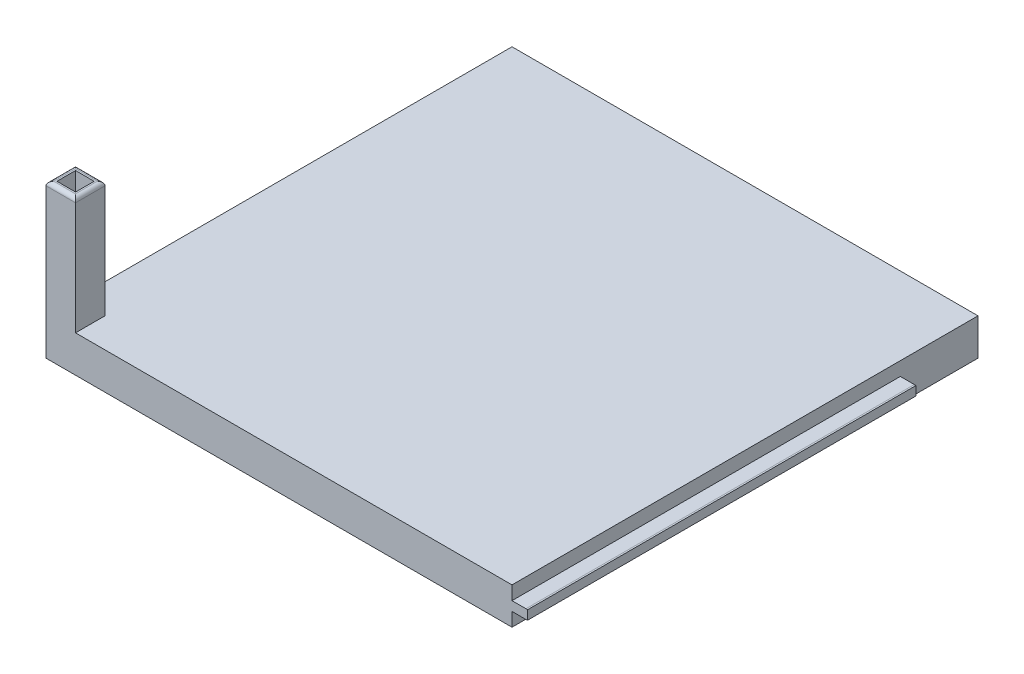
ISO-10303-21;
HEADER;
FILE_DESCRIPTION(('STEP AP214'),'2;1');
FILE_NAME('part.step','',(''),(''),'','','');
FILE_SCHEMA(('AUTOMOTIVE_DESIGN { 1 0 10303 214 1 1 1 1 }'));
ENDSEC;
DATA;
#1=APPLICATION_CONTEXT('core data for automotive mechanical design processes');
#2=APPLICATION_PROTOCOL_DEFINITION('international standard','automotive_design',2000,#1);
#3=PRODUCT_CONTEXT('',#1,'mechanical');
#4=PRODUCT('Part','Part','',(#3));
#5=PRODUCT_RELATED_PRODUCT_CATEGORY('part','',(#4));
#6=PRODUCT_DEFINITION_FORMATION('','',#4);
#7=PRODUCT_DEFINITION_CONTEXT('part definition',#1,'design');
#8=PRODUCT_DEFINITION('design','',#6,#7);
#9=PRODUCT_DEFINITION_SHAPE('','',#8);
#10=(LENGTH_UNIT() NAMED_UNIT(*) SI_UNIT(.MILLI.,.METRE.));
#11=(NAMED_UNIT(*) PLANE_ANGLE_UNIT() SI_UNIT($,.RADIAN.));
#12=(NAMED_UNIT(*) SI_UNIT($,.STERADIAN.) SOLID_ANGLE_UNIT());
#13=UNCERTAINTY_MEASURE_WITH_UNIT(LENGTH_MEASURE(1.E-05),#10,'distance_accuracy_value','');
#14=(GEOMETRIC_REPRESENTATION_CONTEXT(3) GLOBAL_UNCERTAINTY_ASSIGNED_CONTEXT((#13)) GLOBAL_UNIT_ASSIGNED_CONTEXT((#10,
#11,#12)) REPRESENTATION_CONTEXT('',''));
#15=CARTESIAN_POINT('',(0.,0.,0.));
#16=DIRECTION('',(0.,0.,1.));
#17=DIRECTION('',(1.,0.,0.));
#18=AXIS2_PLACEMENT_3D('',#15,#16,#17);
#19=CARTESIAN_POINT('',(-13.9392121212121,48.83,0.));
#20=DIRECTION('',(0.,0.,-1.));
#21=DIRECTION('',(-1.,0.,0.));
#22=AXIS2_PLACEMENT_3D('',#19,#20,#21);
#23=CYLINDRICAL_SURFACE('',#22,1.27);
#24=CARTESIAN_POINT('',(-13.9392121212121,48.83,128.143));
#25=DIRECTION('',(-0.707106781186547,0.,-0.707106781186548));
#26=DIRECTION('',(-0.707106781186548,0.,0.707106781186547));
#27=AXIS2_PLACEMENT_3D('',#24,#25,#26);
#28=ELLIPSE('',#27,1.79605122421383,1.27);
#29=CARTESIAN_POINT('',(-13.9392121212121,50.1,128.143));
#30=VERTEX_POINT('',#29);
#31=CARTESIAN_POINT('',(-12.6692121212121,48.83,126.873));
#32=VERTEX_POINT('',#31);
#33=EDGE_CURVE('E11',#30,#32,#28,.T.);
#34=ORIENTED_EDGE('',*,*,#33,.F.);
#35=DIRECTION('',(0.,0.,-1.));
#36=VECTOR('',#35,1.);
#37=CARTESIAN_POINT('',(-13.9392121212121,50.1,0.));
#38=LINE('',#37,#36);
#39=CARTESIAN_POINT('',(-13.9392121212121,50.1,135.255));
#40=VERTEX_POINT('',#39);
#41=EDGE_CURVE('E560',#40,#30,#38,.T.);
#42=ORIENTED_EDGE('',*,*,#41,.F.);
#43=CARTESIAN_POINT('',(-13.9392121212121,48.83,135.255));
#44=DIRECTION('',(0.707106781186548,0.,-0.707106781186547));
#45=DIRECTION('',(-0.707106781186547,0.,-0.707106781186548));
#46=AXIS2_PLACEMENT_3D('',#43,#44,#45);
#47=ELLIPSE('',#46,1.79605122421383,1.27);
#48=CARTESIAN_POINT('',(-12.6692121212121,48.83,136.525));
#49=VERTEX_POINT('',#48);
#50=EDGE_CURVE('E55',#40,#49,#47,.T.);
#51=ORIENTED_EDGE('',*,*,#50,.T.);
#52=DIRECTION('',(0.,0.,-1.));
#53=VECTOR('',#52,1.);
#54=CARTESIAN_POINT('',(-12.6692121212121,48.83,136.525));
#55=LINE('',#54,#53);
#56=EDGE_CURVE('E587',#32,#49,#55,.F.);
#57=ORIENTED_EDGE('',*,*,#56,.F.);
#58=EDGE_LOOP('',(#34,#42,#51,#57));
#59=FACE_BOUND('',#58,.T.);
#60=ADVANCED_FACE('F47',(#59),#23,.T.);
#61=CARTESIAN_POINT('',(0.,48.83,135.255));
#62=DIRECTION('',(1.,0.,0.));
#63=DIRECTION('',(0.,0.,-1.));
#64=AXIS2_PLACEMENT_3D('',#61,#62,#63);
#65=CYLINDRICAL_SURFACE('',#64,1.27);
#66=ORIENTED_EDGE('',*,*,#50,.F.);
#67=DIRECTION('',(1.,0.,0.));
#68=VECTOR('',#67,1.);
#69=CARTESIAN_POINT('',(0.,50.1,135.255));
#70=LINE('',#69,#68);
#71=CARTESIAN_POINT('',(-21.0512121212121,50.1,135.255));
#72=VERTEX_POINT('',#71);
#73=EDGE_CURVE('E564',#72,#40,#70,.T.);
#74=ORIENTED_EDGE('',*,*,#73,.F.);
#75=CARTESIAN_POINT('',(-21.0512121212121,48.83,135.255));
#76=DIRECTION('',(0.707106781186547,0.,0.707106781186547));
#77=DIRECTION('',(0.707106781186547,0.,-0.707106781186547));
#78=AXIS2_PLACEMENT_3D('',#75,#76,#77);
#79=ELLIPSE('',#78,1.79605122421383,1.27);
#80=CARTESIAN_POINT('',(-22.3212121212121,48.83,136.525));
#81=VERTEX_POINT('',#80);
#82=EDGE_CURVE('E69',#72,#81,#79,.T.);
#83=ORIENTED_EDGE('',*,*,#82,.T.);
#84=DIRECTION('',(1.,0.,0.));
#85=VECTOR('',#84,1.);
#86=CARTESIAN_POINT('',(-22.3212121212121,48.83,136.525));
#87=LINE('',#86,#85);
#88=EDGE_CURVE('E584',#49,#81,#87,.F.);
#89=ORIENTED_EDGE('',*,*,#88,.F.);
#90=EDGE_LOOP('',(#66,#74,#83,#89));
#91=FACE_BOUND('',#90,.T.);
#92=ADVANCED_FACE('F670',(#91),#65,.T.);
#93=CARTESIAN_POINT('',(-21.0512121212121,48.83,0.));
#94=DIRECTION('',(0.,0.,1.));
#95=DIRECTION('',(1.,0.,0.));
#96=AXIS2_PLACEMENT_3D('',#93,#94,#95);
#97=CYLINDRICAL_SURFACE('',#96,1.27);
#98=ORIENTED_EDGE('',*,*,#82,.F.);
#99=DIRECTION('',(0.,0.,1.));
#100=VECTOR('',#99,1.);
#101=CARTESIAN_POINT('',(-21.0512121212121,50.1,0.));
#102=LINE('',#101,#100);
#103=CARTESIAN_POINT('',(-21.0512121212121,50.1,128.143));
#104=VERTEX_POINT('',#103);
#105=EDGE_CURVE('E568',#104,#72,#102,.T.);
#106=ORIENTED_EDGE('',*,*,#105,.F.);
#107=CARTESIAN_POINT('',(-21.0512121212121,48.83,128.143));
#108=DIRECTION('',(-0.707106781186547,0.,0.707106781186547));
#109=DIRECTION('',(0.707106781186547,0.,0.707106781186547));
#110=AXIS2_PLACEMENT_3D('',#107,#108,#109);
#111=ELLIPSE('',#110,1.79605122421383,1.27);
#112=CARTESIAN_POINT('',(-22.3212121212121,48.83,126.873));
#113=VERTEX_POINT('',#112);
#114=EDGE_CURVE('E590',#104,#113,#111,.T.);
#115=ORIENTED_EDGE('',*,*,#114,.T.);
#116=DIRECTION('',(0.,0.,1.));
#117=VECTOR('',#116,1.);
#118=CARTESIAN_POINT('',(-22.3212121212121,48.83,-15.875));
#119=LINE('',#118,#117);
#120=EDGE_CURVE('E580',#81,#113,#119,.F.);
#121=ORIENTED_EDGE('',*,*,#120,.F.);
#122=EDGE_LOOP('',(#98,#106,#115,#121));
#123=FACE_BOUND('',#122,.T.);
#124=ADVANCED_FACE('F675',(#123),#97,.T.);
#125=CARTESIAN_POINT('',(0.,48.83,128.143));
#126=DIRECTION('',(-1.,0.,0.));
#127=DIRECTION('',(0.,0.,1.));
#128=AXIS2_PLACEMENT_3D('',#125,#126,#127);
#129=CYLINDRICAL_SURFACE('',#128,1.27);
#130=DIRECTION('',(-1.,0.,0.));
#131=VECTOR('',#130,1.);
#132=CARTESIAN_POINT('',(0.,50.1,128.143));
#133=LINE('',#132,#131);
#134=EDGE_CURVE('E572',#30,#104,#133,.T.);
#135=ORIENTED_EDGE('',*,*,#134,.F.);
#136=ORIENTED_EDGE('',*,*,#33,.T.);
#137=DIRECTION('',(-1.,0.,0.));
#138=VECTOR('',#137,1.);
#139=CARTESIAN_POINT('',(-22.3212121212121,48.83,126.873));
#140=LINE('',#139,#138);
#141=EDGE_CURVE('E576',#113,#32,#140,.F.);
#142=ORIENTED_EDGE('',*,*,#141,.F.);
#143=ORIENTED_EDGE('',*,*,#114,.F.);
#144=EDGE_LOOP('',(#135,#136,#142,#143));
#145=FACE_BOUND('',#144,.T.);
#146=ADVANCED_FACE('F625',(#145),#129,.T.);
#147=CARTESIAN_POINT('',(0.,50.1,0.));
#148=DIRECTION('',(0.,-1.,0.));
#149=DIRECTION('',(0.,0.,-1.));
#150=AXIS2_PLACEMENT_3D('',#147,#148,#149);
#151=PLANE('',#150);
#152=ORIENTED_EDGE('',*,*,#41,.T.);
#153=ORIENTED_EDGE('',*,*,#134,.T.);
#154=ORIENTED_EDGE('',*,*,#105,.T.);
#155=ORIENTED_EDGE('',*,*,#73,.T.);
#156=EDGE_LOOP('',(#152,#153,#154,#155));
#157=FACE_BOUND('',#156,.T.);
#158=DIRECTION('',(0.,0.,1.));
#159=VECTOR('',#158,1.);
#160=CARTESIAN_POINT('',(-20.5432121212121,50.1,0.));
#161=LINE('',#160,#159);
#162=CARTESIAN_POINT('',(-20.5432121212121,50.1,128.651));
#163=VERTEX_POINT('',#162);
#164=CARTESIAN_POINT('',(-20.5432121212121,50.1,134.747));
#165=VERTEX_POINT('',#164);
#166=EDGE_CURVE('E346',#163,#165,#161,.T.);
#167=ORIENTED_EDGE('',*,*,#166,.F.);
#168=DIRECTION('',(-1.,0.,0.));
#169=VECTOR('',#168,1.);
#170=CARTESIAN_POINT('',(0.,50.1,128.651));
#171=LINE('',#170,#169);
#172=CARTESIAN_POINT('',(-14.4472121212121,50.1,128.651));
#173=VERTEX_POINT('',#172);
#174=EDGE_CURVE('E322',#173,#163,#171,.T.);
#175=ORIENTED_EDGE('',*,*,#174,.F.);
#176=DIRECTION('',(0.,0.,-1.));
#177=VECTOR('',#176,1.);
#178=CARTESIAN_POINT('',(-14.4472121212121,50.1,0.));
#179=LINE('',#178,#177);
#180=CARTESIAN_POINT('',(-14.4472121212121,50.1,134.747));
#181=VERTEX_POINT('',#180);
#182=EDGE_CURVE('E363',#181,#173,#179,.T.);
#183=ORIENTED_EDGE('',*,*,#182,.F.);
#184=DIRECTION('',(1.,0.,0.));
#185=VECTOR('',#184,1.);
#186=CARTESIAN_POINT('',(0.,50.1,134.747));
#187=LINE('',#186,#185);
#188=EDGE_CURVE('E360',#165,#181,#187,.T.);
#189=ORIENTED_EDGE('',*,*,#188,.F.);
#190=EDGE_LOOP('',(#167,#175,#183,#189));
#191=FACE_BOUND('',#190,.T.);
#192=ADVANCED_FACE('F678',(#157,#191),#151,.F.);
#193=CARTESIAN_POINT('',(130.078787878788,12.,-15.875));
#194=DIRECTION('',(-1.,0.,0.));
#195=DIRECTION('',(0.,0.,1.));
#196=AXIS2_PLACEMENT_3D('',#193,#194,#195);
#197=PLANE('',#196);
#198=DIRECTION('',(0.,0.,1.));
#199=VECTOR('',#198,1.);
#200=CARTESIAN_POINT('',(130.078787878788,7.524,9.52500000000001));
#201=LINE('',#200,#199);
#202=CARTESIAN_POINT('',(130.078787878788,7.524,9.52500000000001));
#203=VERTEX_POINT('',#202);
#204=CARTESIAN_POINT('',(130.078787878788,7.524,136.525));
#205=VERTEX_POINT('',#204);
#206=EDGE_CURVE('E464',#203,#205,#201,.T.);
#207=ORIENTED_EDGE('',*,*,#206,.F.);
#208=DIRECTION('',(0.,-1.,0.));
#209=VECTOR('',#208,1.);
#210=CARTESIAN_POINT('',(130.078787878788,7.524,9.52500000000001));
#211=LINE('',#210,#209);
#212=CARTESIAN_POINT('',(130.078787878788,4.476,9.52500000000001));
#213=VERTEX_POINT('',#212);
#214=EDGE_CURVE('E440',#203,#213,#211,.T.);
#215=ORIENTED_EDGE('',*,*,#214,.T.);
#216=DIRECTION('',(0.,0.,1.));
#217=VECTOR('',#216,1.);
#218=CARTESIAN_POINT('',(130.078787878788,4.476,9.52500000000001));
#219=LINE('',#218,#217);
#220=CARTESIAN_POINT('',(130.078787878788,4.476,136.525));
#221=VERTEX_POINT('',#220);
#222=EDGE_CURVE('E455',#213,#221,#219,.T.);
#223=ORIENTED_EDGE('',*,*,#222,.T.);
#224=DIRECTION('',(0.,-1.,0.));
#225=VECTOR('',#224,1.);
#226=CARTESIAN_POINT('',(130.078787878788,12.,136.525));
#227=LINE('',#226,#225);
#228=CARTESIAN_POINT('',(130.078787878788,0.,136.525));
#229=VERTEX_POINT('',#228);
#230=EDGE_CURVE('E525',#221,#229,#227,.T.);
#231=ORIENTED_EDGE('',*,*,#230,.T.);
#232=DIRECTION('',(0.,0.,-1.));
#233=VECTOR('',#232,1.);
#234=CARTESIAN_POINT('',(130.078787878788,0.,-15.875));
#235=LINE('',#234,#233);
#236=CARTESIAN_POINT('',(130.078787878788,0.,-15.875));
#237=VERTEX_POINT('',#236);
#238=EDGE_CURVE('E511',#229,#237,#235,.T.);
#239=ORIENTED_EDGE('',*,*,#238,.T.);
#240=DIRECTION('',(0.,-1.,0.));
#241=VECTOR('',#240,1.);
#242=CARTESIAN_POINT('',(130.078787878788,12.,-15.875));
#243=LINE('',#242,#241);
#244=CARTESIAN_POINT('',(130.078787878788,12.,-15.875));
#245=VERTEX_POINT('',#244);
#246=EDGE_CURVE('E521',#245,#237,#243,.T.);
#247=ORIENTED_EDGE('',*,*,#246,.F.);
#248=DIRECTION('',(0.,0.,-1.));
#249=VECTOR('',#248,1.);
#250=CARTESIAN_POINT('',(130.078787878788,12.,-15.875));
#251=LINE('',#250,#249);
#252=CARTESIAN_POINT('',(130.078787878788,12.,136.525));
#253=VERTEX_POINT('',#252);
#254=EDGE_CURVE('E497',#253,#245,#251,.T.);
#255=ORIENTED_EDGE('',*,*,#254,.F.);
#256=EDGE_CURVE('E526',#253,#205,#227,.T.);
#257=ORIENTED_EDGE('',*,*,#256,.T.);
#258=EDGE_LOOP('',(#207,#215,#223,#231,#239,#247,#255,#257));
#259=FACE_BOUND('',#258,.T.);
#260=ADVANCED_FACE('F641',(#259),#197,.F.);
#261=CARTESIAN_POINT('',(-22.3212121212121,12.,-15.875));
#262=DIRECTION('',(1.,0.,0.));
#263=DIRECTION('',(0.,0.,-1.));
#264=AXIS2_PLACEMENT_3D('',#261,#262,#263);
#265=PLANE('',#264);
#266=DIRECTION('',(0.,-1.,0.));
#267=VECTOR('',#266,1.);
#268=CARTESIAN_POINT('',(-22.3212121212121,12.,136.525));
#269=LINE('',#268,#267);
#270=CARTESIAN_POINT('',(-22.3212121212121,0.,136.525));
#271=VERTEX_POINT('',#270);
#272=EDGE_CURVE('E530',#81,#271,#269,.T.);
#273=ORIENTED_EDGE('',*,*,#272,.F.);
#274=ORIENTED_EDGE('',*,*,#120,.T.);
#275=DIRECTION('',(0.,-1.,0.));
#276=VECTOR('',#275,1.);
#277=CARTESIAN_POINT('',(-22.3212121212121,50.1,126.873));
#278=LINE('',#277,#276);
#279=CARTESIAN_POINT('',(-22.3212121212121,12.,126.873));
#280=VERTEX_POINT('',#279);
#281=EDGE_CURVE('E479',#113,#280,#278,.T.);
#282=ORIENTED_EDGE('',*,*,#281,.T.);
#283=DIRECTION('',(0.,0.,1.));
#284=VECTOR('',#283,1.);
#285=CARTESIAN_POINT('',(-22.3212121212121,12.,-15.875));
#286=LINE('',#285,#284);
#287=CARTESIAN_POINT('',(-22.3212121212121,12.,-15.875));
#288=VERTEX_POINT('',#287);
#289=EDGE_CURVE('E489',#288,#280,#286,.T.);
#290=ORIENTED_EDGE('',*,*,#289,.F.);
#291=DIRECTION('',(0.,-1.,0.));
#292=VECTOR('',#291,1.);
#293=CARTESIAN_POINT('',(-22.3212121212121,12.,-15.875));
#294=LINE('',#293,#292);
#295=CARTESIAN_POINT('',(-22.3212121212121,7.5875,-15.875));
#296=VERTEX_POINT('',#295);
#297=EDGE_CURVE('E517',#288,#296,#294,.T.);
#298=ORIENTED_EDGE('',*,*,#297,.T.);
#299=DIRECTION('',(0.,0.,1.));
#300=VECTOR('',#299,1.);
#301=CARTESIAN_POINT('',(-22.3212121212121,7.5875,-15.875));
#302=LINE('',#301,#300);
#303=CARTESIAN_POINT('',(-22.3212121212121,7.5875,-10.541));
#304=VERTEX_POINT('',#303);
#305=EDGE_CURVE('E406',#296,#304,#302,.T.);
#306=ORIENTED_EDGE('',*,*,#305,.T.);
#307=DIRECTION('',(0.,-1.,0.));
#308=VECTOR('',#307,1.);
#309=CARTESIAN_POINT('',(-22.3212121212121,7.5875,-10.541));
#310=LINE('',#309,#308);
#311=CARTESIAN_POINT('',(-22.3212121212121,4.4125,-10.541));
#312=VERTEX_POINT('',#311);
#313=EDGE_CURVE('E420',#304,#312,#310,.T.);
#314=ORIENTED_EDGE('',*,*,#313,.T.);
#315=DIRECTION('',(0.,0.,1.));
#316=VECTOR('',#315,1.);
#317=CARTESIAN_POINT('',(-22.3212121212121,4.4125,-15.875));
#318=LINE('',#317,#316);
#319=CARTESIAN_POINT('',(-22.3212121212121,4.4125,-15.875));
#320=VERTEX_POINT('',#319);
#321=EDGE_CURVE('E397',#320,#312,#318,.T.);
#322=ORIENTED_EDGE('',*,*,#321,.F.);
#323=CARTESIAN_POINT('',(-22.3212121212121,0.,-15.875));
#324=VERTEX_POINT('',#323);
#325=EDGE_CURVE('E503',#320,#324,#294,.T.);
#326=ORIENTED_EDGE('',*,*,#325,.T.);
#327=DIRECTION('',(0.,0.,1.));
#328=VECTOR('',#327,1.);
#329=CARTESIAN_POINT('',(-22.3212121212121,0.,-15.875));
#330=LINE('',#329,#328);
#331=EDGE_CURVE('E488',#324,#271,#330,.T.);
#332=ORIENTED_EDGE('',*,*,#331,.T.);
#333=EDGE_LOOP('',(#273,#274,#282,#290,#298,#306,#314,#322,#326,#332));
#334=FACE_BOUND('',#333,.T.);
#335=ADVANCED_FACE('F602',(#334),#265,.F.);
#336=CARTESIAN_POINT('',(-22.3212121212121,12.,136.525));
#337=DIRECTION('',(0.,0.,-1.));
#338=DIRECTION('',(-1.,0.,0.));
#339=AXIS2_PLACEMENT_3D('',#336,#337,#338);
#340=PLANE('',#339);
#341=DIRECTION('',(0.,-1.,0.));
#342=VECTOR('',#341,1.);
#343=CARTESIAN_POINT('',(-12.6692121212121,50.1,136.525));
#344=LINE('',#343,#342);
#345=CARTESIAN_POINT('',(-12.6692121212121,12.,136.525));
#346=VERTEX_POINT('',#345);
#347=EDGE_CURVE('E485',#49,#346,#344,.T.);
#348=ORIENTED_EDGE('',*,*,#347,.F.);
#349=ORIENTED_EDGE('',*,*,#88,.T.);
#350=ORIENTED_EDGE('',*,*,#272,.T.);
#351=DIRECTION('',(1.,0.,0.));
#352=VECTOR('',#351,1.);
#353=CARTESIAN_POINT('',(-22.3212121212121,0.,136.525));
#354=LINE('',#353,#352);
#355=EDGE_CURVE('E507',#271,#229,#354,.T.);
#356=ORIENTED_EDGE('',*,*,#355,.T.);
#357=ORIENTED_EDGE('',*,*,#230,.F.);
#358=DIRECTION('',(1.,0.,0.));
#359=VECTOR('',#358,1.);
#360=CARTESIAN_POINT('',(130.078787878788,4.476,136.525));
#361=LINE('',#360,#359);
#362=CARTESIAN_POINT('',(134.650787878788,4.476,136.525));
#363=VERTEX_POINT('',#362);
#364=EDGE_CURVE('E430',#221,#363,#361,.T.);
#365=ORIENTED_EDGE('',*,*,#364,.T.);
#366=DIRECTION('',(-0.997564050259824,-0.0697564737441264,0.));
#367=VECTOR('',#366,1.);
#368=CARTESIAN_POINT('',(134.650787878788,4.476,136.525));
#369=LINE('',#368,#367);
#370=CARTESIAN_POINT('',(135.158787878788,4.51152282046731,136.525));
#371=VERTEX_POINT('',#370);
#372=EDGE_CURVE('E551',#363,#371,#369,.F.);
#373=ORIENTED_EDGE('',*,*,#372,.T.);
#374=DIRECTION('',(0.,1.,0.));
#375=VECTOR('',#374,1.);
#376=CARTESIAN_POINT('',(135.158787878788,7.524,136.525));
#377=LINE('',#376,#375);
#378=CARTESIAN_POINT('',(135.158787878788,7.48847717953269,136.525));
#379=VERTEX_POINT('',#378);
#380=EDGE_CURVE('E459',#371,#379,#377,.T.);
#381=ORIENTED_EDGE('',*,*,#380,.T.);
#382=DIRECTION('',(0.997564050259824,-0.0697564737441272,0.));
#383=VECTOR('',#382,1.);
#384=CARTESIAN_POINT('',(135.158787878788,7.48847717953269,136.525));
#385=LINE('',#384,#383);
#386=CARTESIAN_POINT('',(134.650787878788,7.524,136.525));
#387=VERTEX_POINT('',#386);
#388=EDGE_CURVE('E537',#379,#387,#385,.F.);
#389=ORIENTED_EDGE('',*,*,#388,.T.);
#390=DIRECTION('',(-1.,0.,0.));
#391=VECTOR('',#390,1.);
#392=CARTESIAN_POINT('',(130.078787878788,7.524,136.525));
#393=LINE('',#392,#391);
#394=EDGE_CURVE('E445',#387,#205,#393,.T.);
#395=ORIENTED_EDGE('',*,*,#394,.T.);
#396=ORIENTED_EDGE('',*,*,#256,.F.);
#397=DIRECTION('',(1.,0.,0.));
#398=VECTOR('',#397,1.);
#399=CARTESIAN_POINT('',(-22.3212121212121,12.,136.525));
#400=LINE('',#399,#398);
#401=EDGE_CURVE('E493',#346,#253,#400,.T.);
#402=ORIENTED_EDGE('',*,*,#401,.F.);
#403=EDGE_LOOP('',(#348,#349,#350,#356,#357,#365,#373,#381,#389,#395,#396,#402));
#404=FACE_BOUND('',#403,.T.);
#405=ADVANCED_FACE('F617',(#404),#340,.F.);
#406=CARTESIAN_POINT('',(-22.3212121212121,12.,-15.875));
#407=DIRECTION('',(0.,0.,1.));
#408=DIRECTION('',(1.,0.,0.));
#409=AXIS2_PLACEMENT_3D('',#406,#407,#408);
#410=PLANE('',#409);
#411=ORIENTED_EDGE('',*,*,#325,.F.);
#412=DIRECTION('',(-1.,0.,0.));
#413=VECTOR('',#412,1.);
#414=CARTESIAN_POINT('',(127.538787878788,4.4125,-15.875));
#415=LINE('',#414,#413);
#416=CARTESIAN_POINT('',(127.538787878788,4.4125,-15.875));
#417=VERTEX_POINT('',#416);
#418=EDGE_CURVE('E427',#417,#320,#415,.T.);
#419=ORIENTED_EDGE('',*,*,#418,.F.);
#420=DIRECTION('',(0.,-1.,0.));
#421=VECTOR('',#420,1.);
#422=CARTESIAN_POINT('',(127.538787878788,7.5875,-15.875));
#423=LINE('',#422,#421);
#424=CARTESIAN_POINT('',(127.538787878788,7.5875,-15.875));
#425=VERTEX_POINT('',#424);
#426=EDGE_CURVE('E412',#425,#417,#423,.T.);
#427=ORIENTED_EDGE('',*,*,#426,.F.);
#428=DIRECTION('',(-1.,0.,0.));
#429=VECTOR('',#428,1.);
#430=CARTESIAN_POINT('',(127.538787878788,7.5875,-15.875));
#431=LINE('',#430,#429);
#432=EDGE_CURVE('E431',#425,#296,#431,.T.);
#433=ORIENTED_EDGE('',*,*,#432,.T.);
#434=ORIENTED_EDGE('',*,*,#297,.F.);
#435=DIRECTION('',(-1.,0.,0.));
#436=VECTOR('',#435,1.);
#437=CARTESIAN_POINT('',(-22.3212121212121,12.,-15.875));
#438=LINE('',#437,#436);
#439=EDGE_CURVE('E500',#245,#288,#438,.T.);
#440=ORIENTED_EDGE('',*,*,#439,.F.);
#441=ORIENTED_EDGE('',*,*,#246,.T.);
#442=DIRECTION('',(-1.,0.,0.));
#443=VECTOR('',#442,1.);
#444=CARTESIAN_POINT('',(-22.3212121212121,0.,-15.875));
#445=LINE('',#444,#443);
#446=EDGE_CURVE('E494',#237,#324,#445,.T.);
#447=ORIENTED_EDGE('',*,*,#446,.T.);
#448=EDGE_LOOP('',(#411,#419,#427,#433,#434,#440,#441,#447));
#449=FACE_BOUND('',#448,.T.);
#450=ADVANCED_FACE('F607',(#449),#410,.F.);
#451=CARTESIAN_POINT('',(0.,12.,0.));
#452=DIRECTION('',(0.,1.,0.));
#453=DIRECTION('',(0.,0.,1.));
#454=AXIS2_PLACEMENT_3D('',#451,#452,#453);
#455=PLANE('',#454);
#456=DIRECTION('',(-1.,0.,0.));
#457=VECTOR('',#456,1.);
#458=CARTESIAN_POINT('',(-22.3212121212121,12.,126.873));
#459=LINE('',#458,#457);
#460=CARTESIAN_POINT('',(-12.6692121212121,12.,126.873));
#461=VERTEX_POINT('',#460);
#462=EDGE_CURVE('E475',#461,#280,#459,.T.);
#463=ORIENTED_EDGE('',*,*,#462,.F.);
#464=DIRECTION('',(0.,0.,-1.));
#465=VECTOR('',#464,1.);
#466=CARTESIAN_POINT('',(-12.6692121212121,12.,136.525));
#467=LINE('',#466,#465);
#468=EDGE_CURVE('E468',#346,#461,#467,.T.);
#469=ORIENTED_EDGE('',*,*,#468,.F.);
#470=ORIENTED_EDGE('',*,*,#401,.T.);
#471=ORIENTED_EDGE('',*,*,#254,.T.);
#472=ORIENTED_EDGE('',*,*,#439,.T.);
#473=ORIENTED_EDGE('',*,*,#289,.T.);
#474=EDGE_LOOP('',(#463,#469,#470,#471,#472,#473));
#475=FACE_BOUND('',#474,.T.);
#476=ADVANCED_FACE('F632',(#475),#455,.T.);
#477=CARTESIAN_POINT('',(0.,0.,0.));
#478=DIRECTION('',(0.,1.,0.));
#479=DIRECTION('',(0.,0.,1.));
#480=AXIS2_PLACEMENT_3D('',#477,#478,#479);
#481=PLANE('',#480);
#482=CARTESIAN_POINT('',(100.106787878788,0.,9.12499999999999));
#483=DIRECTION('',(0.,1.,0.));
#484=DIRECTION('',(0.,0.,1.));
#485=AXIS2_PLACEMENT_3D('',#482,#483,#484);
#486=CIRCLE('',#485,4.445);
#487=CARTESIAN_POINT('',(100.106787878788,0.,13.57));
#488=VERTEX_POINT('',#487);
#489=EDGE_CURVE('E392',#488,#488,#486,.T.);
#490=ORIENTED_EDGE('',*,*,#489,.T.);
#491=EDGE_LOOP('',(#490));
#492=FACE_BOUND('',#491,.T.);
#493=ORIENTED_EDGE('',*,*,#331,.F.);
#494=ORIENTED_EDGE('',*,*,#446,.F.);
#495=ORIENTED_EDGE('',*,*,#238,.F.);
#496=ORIENTED_EDGE('',*,*,#355,.F.);
#497=EDGE_LOOP('',(#493,#494,#495,#496));
#498=FACE_BOUND('',#497,.T.);
#499=ADVANCED_FACE('F613',(#492,#498),#481,.F.);
#500=CARTESIAN_POINT('',(-12.6692121212121,50.1,136.525));
#501=DIRECTION('',(-1.,0.,0.));
#502=DIRECTION('',(0.,0.,1.));
#503=AXIS2_PLACEMENT_3D('',#500,#501,#502);
#504=PLANE('',#503);
#505=DIRECTION('',(0.,-1.,0.));
#506=VECTOR('',#505,1.);
#507=CARTESIAN_POINT('',(-12.6692121212121,50.1,126.873));
#508=LINE('',#507,#506);
#509=EDGE_CURVE('E482',#32,#461,#508,.T.);
#510=ORIENTED_EDGE('',*,*,#509,.F.);
#511=ORIENTED_EDGE('',*,*,#56,.T.);
#512=ORIENTED_EDGE('',*,*,#347,.T.);
#513=ORIENTED_EDGE('',*,*,#468,.T.);
#514=EDGE_LOOP('',(#510,#511,#512,#513));
#515=FACE_BOUND('',#514,.T.);
#516=ADVANCED_FACE('F635',(#515),#504,.F.);
#517=CARTESIAN_POINT('',(-22.3212121212121,50.1,126.873));
#518=DIRECTION('',(0.,0.,1.));
#519=DIRECTION('',(1.,0.,0.));
#520=AXIS2_PLACEMENT_3D('',#517,#518,#519);
#521=PLANE('',#520);
#522=ORIENTED_EDGE('',*,*,#281,.F.);
#523=ORIENTED_EDGE('',*,*,#141,.T.);
#524=ORIENTED_EDGE('',*,*,#509,.T.);
#525=ORIENTED_EDGE('',*,*,#462,.T.);
#526=EDGE_LOOP('',(#522,#523,#524,#525));
#527=FACE_BOUND('',#526,.T.);
#528=ADVANCED_FACE('F628',(#527),#521,.F.);
#529=CARTESIAN_POINT('',(130.078787878788,7.524,9.52500000000001));
#530=DIRECTION('',(0.,1.,0.));
#531=DIRECTION('',(0.,0.,1.));
#532=AXIS2_PLACEMENT_3D('',#529,#530,#531);
#533=PLANE('',#532);
#534=ORIENTED_EDGE('',*,*,#394,.F.);
#535=DIRECTION('',(0.,0.,-1.));
#536=VECTOR('',#535,1.);
#537=CARTESIAN_POINT('',(134.650787878788,7.524,9.52500000000001));
#538=LINE('',#537,#536);
#539=CARTESIAN_POINT('',(134.650787878788,7.524,9.52500000000001));
#540=VERTEX_POINT('',#539);
#541=EDGE_CURVE('E540',#387,#540,#538,.T.);
#542=ORIENTED_EDGE('',*,*,#541,.T.);
#543=DIRECTION('',(-1.,0.,0.));
#544=VECTOR('',#543,1.);
#545=CARTESIAN_POINT('',(130.078787878788,7.524,9.52500000000001));
#546=LINE('',#545,#544);
#547=EDGE_CURVE('E452',#540,#203,#546,.T.);
#548=ORIENTED_EDGE('',*,*,#547,.T.);
#549=ORIENTED_EDGE('',*,*,#206,.T.);
#550=EDGE_LOOP('',(#534,#542,#548,#549));
#551=FACE_BOUND('',#550,.T.);
#552=ADVANCED_FACE('F718',(#551),#533,.T.);
#553=CARTESIAN_POINT('',(135.158787878788,7.524,9.52500000000001));
#554=DIRECTION('',(1.,0.,0.));
#555=DIRECTION('',(0.,0.,-1.));
#556=AXIS2_PLACEMENT_3D('',#553,#554,#555);
#557=PLANE('',#556);
#558=ORIENTED_EDGE('',*,*,#380,.F.);
#559=DIRECTION('',(0.,0.,-1.));
#560=VECTOR('',#559,1.);
#561=CARTESIAN_POINT('',(135.158787878788,4.51152282046731,9.52500000000001));
#562=LINE('',#561,#560);
#563=CARTESIAN_POINT('',(135.158787878788,4.51152282046731,9.52500000000001));
#564=VERTEX_POINT('',#563);
#565=EDGE_CURVE('E554',#371,#564,#562,.T.);
#566=ORIENTED_EDGE('',*,*,#565,.T.);
#567=DIRECTION('',(0.,1.,0.));
#568=VECTOR('',#567,1.);
#569=CARTESIAN_POINT('',(135.158787878788,7.524,9.52500000000001));
#570=LINE('',#569,#568);
#571=CARTESIAN_POINT('',(135.158787878788,7.48847717953269,9.52500000000001));
#572=VERTEX_POINT('',#571);
#573=EDGE_CURVE('E449',#564,#572,#570,.T.);
#574=ORIENTED_EDGE('',*,*,#573,.T.);
#575=DIRECTION('',(0.,0.,1.));
#576=VECTOR('',#575,1.);
#577=CARTESIAN_POINT('',(135.158787878788,7.48847717953269,9.52500000000001));
#578=LINE('',#577,#576);
#579=EDGE_CURVE('E533',#572,#379,#578,.T.);
#580=ORIENTED_EDGE('',*,*,#579,.T.);
#581=EDGE_LOOP('',(#558,#566,#574,#580));
#582=FACE_BOUND('',#581,.T.);
#583=ADVANCED_FACE('F724',(#582),#557,.T.);
#584=CARTESIAN_POINT('',(130.078787878788,4.476,9.52500000000001));
#585=DIRECTION('',(0.,-1.,0.));
#586=DIRECTION('',(0.,0.,-1.));
#587=AXIS2_PLACEMENT_3D('',#584,#585,#586);
#588=PLANE('',#587);
#589=DIRECTION('',(1.,0.,0.));
#590=VECTOR('',#589,1.);
#591=CARTESIAN_POINT('',(130.078787878788,4.476,9.52500000000001));
#592=LINE('',#591,#590);
#593=CARTESIAN_POINT('',(134.650787878788,4.476,9.52500000000001));
#594=VERTEX_POINT('',#593);
#595=EDGE_CURVE('E444',#213,#594,#592,.T.);
#596=ORIENTED_EDGE('',*,*,#595,.T.);
#597=DIRECTION('',(0.,0.,1.));
#598=VECTOR('',#597,1.);
#599=CARTESIAN_POINT('',(134.650787878788,4.476,9.52500000000001));
#600=LINE('',#599,#598);
#601=EDGE_CURVE('E547',#594,#363,#600,.T.);
#602=ORIENTED_EDGE('',*,*,#601,.T.);
#603=ORIENTED_EDGE('',*,*,#364,.F.);
#604=ORIENTED_EDGE('',*,*,#222,.F.);
#605=EDGE_LOOP('',(#596,#602,#603,#604));
#606=FACE_BOUND('',#605,.T.);
#607=ADVANCED_FACE('F721',(#606),#588,.T.);
#608=CARTESIAN_POINT('',(0.,0.,9.52500000000001));
#609=DIRECTION('',(0.,0.,1.));
#610=DIRECTION('',(1.,0.,0.));
#611=AXIS2_PLACEMENT_3D('',#608,#609,#610);
#612=PLANE('',#611);
#613=ORIENTED_EDGE('',*,*,#573,.F.);
#614=DIRECTION('',(0.997564050259824,0.0697564737441264,0.));
#615=VECTOR('',#614,1.);
#616=CARTESIAN_POINT('',(134.650787878788,4.476,9.52500000000001));
#617=LINE('',#616,#615);
#618=EDGE_CURVE('E557',#564,#594,#617,.F.);
#619=ORIENTED_EDGE('',*,*,#618,.T.);
#620=ORIENTED_EDGE('',*,*,#595,.F.);
#621=ORIENTED_EDGE('',*,*,#214,.F.);
#622=ORIENTED_EDGE('',*,*,#547,.F.);
#623=DIRECTION('',(-0.997564050259824,0.0697564737441272,0.));
#624=VECTOR('',#623,1.);
#625=CARTESIAN_POINT('',(135.158787878788,7.48847717953269,9.52500000000001));
#626=LINE('',#625,#624);
#627=EDGE_CURVE('E543',#540,#572,#626,.F.);
#628=ORIENTED_EDGE('',*,*,#627,.T.);
#629=EDGE_LOOP('',(#613,#619,#620,#621,#622,#628));
#630=FACE_BOUND('',#629,.T.);
#631=ADVANCED_FACE('F700',(#630),#612,.F.);
#632=CARTESIAN_POINT('',(135.158787878788,7.48847717953269,9.52500000000001));
#633=DIRECTION('',(-0.0697564737441272,-0.997564050259824,0.));
#634=DIRECTION('',(0.,0.,1.));
#635=AXIS2_PLACEMENT_3D('',#632,#633,#634);
#636=PLANE('',#635);
#637=ORIENTED_EDGE('',*,*,#627,.F.);
#638=ORIENTED_EDGE('',*,*,#541,.F.);
#639=ORIENTED_EDGE('',*,*,#388,.F.);
#640=ORIENTED_EDGE('',*,*,#579,.F.);
#641=EDGE_LOOP('',(#637,#638,#639,#640));
#642=FACE_BOUND('',#641,.T.);
#643=ADVANCED_FACE('F694',(#642),#636,.F.);
#644=CARTESIAN_POINT('',(134.650787878788,4.476,9.52500000000001));
#645=DIRECTION('',(-0.0697564737441264,0.997564050259824,0.));
#646=DIRECTION('',(0.,0.,1.));
#647=AXIS2_PLACEMENT_3D('',#644,#645,#646);
#648=PLANE('',#647);
#649=ORIENTED_EDGE('',*,*,#618,.F.);
#650=ORIENTED_EDGE('',*,*,#565,.F.);
#651=ORIENTED_EDGE('',*,*,#372,.F.);
#652=ORIENTED_EDGE('',*,*,#601,.F.);
#653=EDGE_LOOP('',(#649,#650,#651,#652));
#654=FACE_BOUND('',#653,.T.);
#655=ADVANCED_FACE('F688',(#654),#648,.F.);
#656=CARTESIAN_POINT('',(127.538787878788,4.4125,-15.875));
#657=DIRECTION('',(0.,-1.,0.));
#658=DIRECTION('',(0.,0.,-1.));
#659=AXIS2_PLACEMENT_3D('',#656,#657,#658);
#660=PLANE('',#659);
#661=ORIENTED_EDGE('',*,*,#321,.T.);
#662=DIRECTION('',(-1.,0.,0.));
#663=VECTOR('',#662,1.);
#664=CARTESIAN_POINT('',(127.538787878788,4.4125,-10.541));
#665=LINE('',#664,#663);
#666=CARTESIAN_POINT('',(127.538787878788,4.4125,-10.541));
#667=VERTEX_POINT('',#666);
#668=EDGE_CURVE('E416',#667,#312,#665,.T.);
#669=ORIENTED_EDGE('',*,*,#668,.F.);
#670=DIRECTION('',(0.,0.,1.));
#671=VECTOR('',#670,1.);
#672=CARTESIAN_POINT('',(127.538787878788,4.4125,-15.875));
#673=LINE('',#672,#671);
#674=EDGE_CURVE('E401',#417,#667,#673,.T.);
#675=ORIENTED_EDGE('',*,*,#674,.F.);
#676=ORIENTED_EDGE('',*,*,#418,.T.);
#677=EDGE_LOOP('',(#661,#669,#675,#676));
#678=FACE_BOUND('',#677,.T.);
#679=ADVANCED_FACE('F653',(#678),#660,.F.);
#680=CARTESIAN_POINT('',(127.538787878788,7.5875,-15.875));
#681=DIRECTION('',(0.,-1.,0.));
#682=DIRECTION('',(0.,0.,-1.));
#683=AXIS2_PLACEMENT_3D('',#680,#681,#682);
#684=PLANE('',#683);
#685=ORIENTED_EDGE('',*,*,#305,.F.);
#686=ORIENTED_EDGE('',*,*,#432,.F.);
#687=DIRECTION('',(0.,0.,1.));
#688=VECTOR('',#687,1.);
#689=CARTESIAN_POINT('',(127.538787878788,7.5875,-15.875));
#690=LINE('',#689,#688);
#691=CARTESIAN_POINT('',(127.538787878788,7.5875,-10.541));
#692=VERTEX_POINT('',#691);
#693=EDGE_CURVE('E409',#425,#692,#690,.T.);
#694=ORIENTED_EDGE('',*,*,#693,.T.);
#695=DIRECTION('',(-1.,0.,0.));
#696=VECTOR('',#695,1.);
#697=CARTESIAN_POINT('',(127.538787878788,7.5875,-10.541));
#698=LINE('',#697,#696);
#699=EDGE_CURVE('E435',#692,#304,#698,.T.);
#700=ORIENTED_EDGE('',*,*,#699,.T.);
#701=EDGE_LOOP('',(#685,#686,#694,#700));
#702=FACE_BOUND('',#701,.T.);
#703=ADVANCED_FACE('F646',(#702),#684,.T.);
#704=CARTESIAN_POINT('',(127.538787878788,7.5875,-10.541));
#705=DIRECTION('',(0.,0.,-1.));
#706=DIRECTION('',(-1.,0.,0.));
#707=AXIS2_PLACEMENT_3D('',#704,#705,#706);
#708=PLANE('',#707);
#709=ORIENTED_EDGE('',*,*,#313,.F.);
#710=ORIENTED_EDGE('',*,*,#699,.F.);
#711=DIRECTION('',(0.,-1.,0.));
#712=VECTOR('',#711,1.);
#713=CARTESIAN_POINT('',(127.538787878788,7.5875,-10.541));
#714=LINE('',#713,#712);
#715=EDGE_CURVE('E405',#692,#667,#714,.T.);
#716=ORIENTED_EDGE('',*,*,#715,.T.);
#717=ORIENTED_EDGE('',*,*,#668,.T.);
#718=EDGE_LOOP('',(#709,#710,#716,#717));
#719=FACE_BOUND('',#718,.T.);
#720=ADVANCED_FACE('F650',(#719),#708,.T.);
#721=CARTESIAN_POINT('',(127.538787878788,0.,0.));
#722=DIRECTION('',(1.,0.,0.));
#723=DIRECTION('',(0.,0.,-1.));
#724=AXIS2_PLACEMENT_3D('',#721,#722,#723);
#725=PLANE('',#724);
#726=ORIENTED_EDGE('',*,*,#674,.T.);
#727=ORIENTED_EDGE('',*,*,#715,.F.);
#728=ORIENTED_EDGE('',*,*,#693,.F.);
#729=ORIENTED_EDGE('',*,*,#426,.T.);
#730=EDGE_LOOP('',(#726,#727,#728,#729));
#731=FACE_BOUND('',#730,.T.);
#732=ADVANCED_FACE('F655',(#731),#725,.F.);
#733=CARTESIAN_POINT('',(100.106787878788,-15.,9.12499999999999));
#734=DIRECTION('',(0.,1.,0.));
#735=DIRECTION('',(0.,0.,1.));
#736=AXIS2_PLACEMENT_3D('',#733,#734,#735);
#737=CYLINDRICAL_SURFACE('',#736,4.445);
#738=CARTESIAN_POINT('',(100.106787878788,-15.,9.12499999999999));
#739=DIRECTION('',(0.,1.,0.));
#740=DIRECTION('',(0.,0.,1.));
#741=AXIS2_PLACEMENT_3D('',#738,#739,#740);
#742=CIRCLE('',#741,4.445);
#743=CARTESIAN_POINT('',(100.106787878788,-15.,13.57));
#744=VERTEX_POINT('',#743);
#745=EDGE_CURVE('E393',#744,#744,#742,.T.);
#746=ORIENTED_EDGE('',*,*,#745,.T.);
#747=EDGE_LOOP('',(#746));
#748=FACE_BOUND('',#747,.T.);
#749=ORIENTED_EDGE('',*,*,#489,.F.);
#750=EDGE_LOOP('',(#749));
#751=FACE_BOUND('',#750,.T.);
#752=ADVANCED_FACE('F657',(#748,#751),#737,.T.);
#753=CARTESIAN_POINT('',(100.106787878788,-15.,9.12499999999999));
#754=DIRECTION('',(0.,1.,0.));
#755=DIRECTION('',(0.,0.,1.));
#756=AXIS2_PLACEMENT_3D('',#753,#754,#755);
#757=PLANE('',#756);
#758=CARTESIAN_POINT('',(100.106787878788,-15.,9.12499999999999));
#759=DIRECTION('',(0.,-1.,0.));
#760=DIRECTION('',(0.,0.,-1.));
#761=AXIS2_PLACEMENT_3D('',#758,#759,#760);
#762=CIRCLE('',#761,1.);
#763=CARTESIAN_POINT('',(100.106787878788,-15.,8.12499999999999));
#764=VERTEX_POINT('',#763);
#765=EDGE_CURVE('E384',#764,#764,#762,.T.);
#766=ORIENTED_EDGE('',*,*,#765,.F.);
#767=EDGE_LOOP('',(#766));
#768=FACE_BOUND('',#767,.T.);
#769=ORIENTED_EDGE('',*,*,#745,.F.);
#770=EDGE_LOOP('',(#769));
#771=FACE_BOUND('',#770,.T.);
#772=ADVANCED_FACE('F664',(#768,#771),#757,.F.);
#773=CARTESIAN_POINT('',(100.106787878788,-10.428,9.12499999999999));
#774=DIRECTION('',(0.,-1.,0.));
#775=DIRECTION('',(0.,0.,-1.));
#776=AXIS2_PLACEMENT_3D('',#773,#774,#775);
#777=CONICAL_SURFACE('',#776,1.,1.02974425867666);
#778=CARTESIAN_POINT('',(100.106787878788,-9.82713938097244,9.12499999999999));
#779=VERTEX_POINT('',#778);
#780=VERTEX_LOOP('',#779);
#781=FACE_BOUND('',#780,.T.);
#782=CARTESIAN_POINT('',(100.106787878788,-10.428,9.12499999999999));
#783=DIRECTION('',(0.,-1.,0.));
#784=DIRECTION('',(0.,0.,-1.));
#785=AXIS2_PLACEMENT_3D('',#782,#783,#784);
#786=CIRCLE('',#785,1.);
#787=CARTESIAN_POINT('',(100.106787878788,-10.428,8.12499999999999));
#788=VERTEX_POINT('',#787);
#789=EDGE_CURVE('E388',#788,#788,#786,.T.);
#790=ORIENTED_EDGE('',*,*,#789,.T.);
#791=EDGE_LOOP('',(#790));
#792=FACE_BOUND('',#791,.T.);
#793=ADVANCED_FACE('F766',(#781,#792),#777,.F.);
#794=CARTESIAN_POINT('',(100.106787878788,-15.,9.12499999999999));
#795=DIRECTION('',(0.,-1.,0.));
#796=DIRECTION('',(0.,0.,-1.));
#797=AXIS2_PLACEMENT_3D('',#794,#795,#796);
#798=CYLINDRICAL_SURFACE('',#797,1.);
#799=ORIENTED_EDGE('',*,*,#789,.F.);
#800=EDGE_LOOP('',(#799));
#801=FACE_BOUND('',#800,.T.);
#802=ORIENTED_EDGE('',*,*,#765,.T.);
#803=EDGE_LOOP('',(#802));
#804=FACE_BOUND('',#803,.T.);
#805=ADVANCED_FACE('F776',(#801,#804),#798,.F.);
#806=CARTESIAN_POINT('',(100.106787878788,-15.,9.12499999999999));
#807=DIRECTION('',(0.,1.,0.));
#808=DIRECTION('',(0.,0.,1.));
#809=AXIS2_PLACEMENT_3D('',#806,#807,#808);
#810=CYLINDRICAL_SURFACE('',#809,2.667);
#811=CARTESIAN_POINT('',(100.106787878788,1.778,9.12499999999999));
#812=DIRECTION('',(0.,1.,0.));
#813=DIRECTION('',(0.,0.,1.));
#814=AXIS2_PLACEMENT_3D('',#811,#812,#813);
#815=CIRCLE('',#814,2.667);
#816=CARTESIAN_POINT('',(100.106787878788,1.778,11.792));
#817=VERTEX_POINT('',#816);
#818=EDGE_CURVE('E311',#817,#817,#815,.T.);
#819=ORIENTED_EDGE('',*,*,#818,.T.);
#820=EDGE_LOOP('',(#819));
#821=FACE_BOUND('',#820,.T.);
#822=CARTESIAN_POINT('',(100.106787878788,-9.35536047167009,9.12499999999999));
#823=DIRECTION('',(0.,-1.,0.));
#824=DIRECTION('',(0.,0.,-1.));
#825=AXIS2_PLACEMENT_3D('',#822,#823,#824);
#826=CIRCLE('',#825,2.667);
#827=CARTESIAN_POINT('',(100.106787878788,-9.35536047167009,6.45799999999999));
#828=VERTEX_POINT('',#827);
#829=EDGE_CURVE('E380',#828,#828,#826,.F.);
#830=ORIENTED_EDGE('',*,*,#829,.F.);
#831=EDGE_LOOP('',(#830));
#832=FACE_BOUND('',#831,.T.);
#833=ADVANCED_FACE('F786',(#821,#832),#810,.F.);
#834=CARTESIAN_POINT('',(128.300787878788,12.,-15.875));
#835=DIRECTION('',(-1.,0.,0.));
#836=DIRECTION('',(0.,0.,1.));
#837=AXIS2_PLACEMENT_3D('',#834,#835,#836);
#838=PLANE('',#837);
#839=DIRECTION('',(0.,-1.,0.));
#840=VECTOR('',#839,1.);
#841=CARTESIAN_POINT('',(128.300787878788,12.,-8.76300000000001));
#842=LINE('',#841,#840);
#843=CARTESIAN_POINT('',(128.300787878788,9.3655,-8.76300000000001));
#844=VERTEX_POINT('',#843);
#845=CARTESIAN_POINT('',(128.300787878788,2.6345,-8.76300000000001));
#846=VERTEX_POINT('',#845);
#847=EDGE_CURVE('E377',#844,#846,#842,.T.);
#848=ORIENTED_EDGE('',*,*,#847,.T.);
#849=DIRECTION('',(0.,0.,-1.));
#850=VECTOR('',#849,1.);
#851=CARTESIAN_POINT('',(128.300787878788,2.6345,-15.875));
#852=LINE('',#851,#850);
#853=CARTESIAN_POINT('',(128.300787878788,2.6345,-14.097));
#854=VERTEX_POINT('',#853);
#855=EDGE_CURVE('E300',#846,#854,#852,.T.);
#856=ORIENTED_EDGE('',*,*,#855,.T.);
#857=DIRECTION('',(0.,-1.,0.));
#858=VECTOR('',#857,1.);
#859=CARTESIAN_POINT('',(128.300787878788,12.,-14.097));
#860=LINE('',#859,#858);
#861=CARTESIAN_POINT('',(128.300787878788,1.778,-14.097));
#862=VERTEX_POINT('',#861);
#863=EDGE_CURVE('E278',#854,#862,#860,.T.);
#864=ORIENTED_EDGE('',*,*,#863,.T.);
#865=DIRECTION('',(0.,0.,-1.));
#866=VECTOR('',#865,1.);
#867=CARTESIAN_POINT('',(128.300787878788,1.778,-15.875));
#868=LINE('',#867,#866);
#869=CARTESIAN_POINT('',(128.300787878788,1.778,134.747));
#870=VERTEX_POINT('',#869);
#871=EDGE_CURVE('E269',#870,#862,#868,.T.);
#872=ORIENTED_EDGE('',*,*,#871,.F.);
#873=DIRECTION('',(0.,-1.,0.));
#874=VECTOR('',#873,1.);
#875=CARTESIAN_POINT('',(128.300787878788,12.,134.747));
#876=LINE('',#875,#874);
#877=CARTESIAN_POINT('',(128.300787878788,10.222,134.747));
#878=VERTEX_POINT('',#877);
#879=EDGE_CURVE('E249',#878,#870,#876,.T.);
#880=ORIENTED_EDGE('',*,*,#879,.F.);
#881=DIRECTION('',(0.,0.,-1.));
#882=VECTOR('',#881,1.);
#883=CARTESIAN_POINT('',(128.300787878788,10.222,-15.875));
#884=LINE('',#883,#882);
#885=CARTESIAN_POINT('',(128.300787878788,10.222,-14.097));
#886=VERTEX_POINT('',#885);
#887=EDGE_CURVE('E289',#878,#886,#884,.T.);
#888=ORIENTED_EDGE('',*,*,#887,.T.);
#889=CARTESIAN_POINT('',(128.300787878788,9.3655,-14.097));
#890=VERTEX_POINT('',#889);
#891=EDGE_CURVE('E262',#886,#890,#860,.T.);
#892=ORIENTED_EDGE('',*,*,#891,.T.);
#893=DIRECTION('',(0.,0.,-1.));
#894=VECTOR('',#893,1.);
#895=CARTESIAN_POINT('',(128.300787878788,9.3655,-15.875));
#896=LINE('',#895,#894);
#897=EDGE_CURVE('E374',#844,#890,#896,.T.);
#898=ORIENTED_EDGE('',*,*,#897,.F.);
#899=EDGE_LOOP('',(#848,#856,#864,#872,#880,#888,#892,#898));
#900=FACE_BOUND('',#899,.T.);
#901=ADVANCED_FACE('F276',(#900),#838,.T.);
#902=CARTESIAN_POINT('',(127.538787878788,2.6345,-15.875));
#903=DIRECTION('',(0.,-1.,0.));
#904=DIRECTION('',(0.,0.,-1.));
#905=AXIS2_PLACEMENT_3D('',#902,#903,#904);
#906=PLANE('',#905);
#907=DIRECTION('',(-1.,0.,0.));
#908=VECTOR('',#907,1.);
#909=CARTESIAN_POINT('',(127.538787878788,2.6345,-8.76300000000001));
#910=LINE('',#909,#908);
#911=CARTESIAN_POINT('',(-20.5432121212121,2.6345,-8.76300000000001));
#912=VERTEX_POINT('',#911);
#913=EDGE_CURVE('E331',#846,#912,#910,.T.);
#914=ORIENTED_EDGE('',*,*,#913,.T.);
#915=DIRECTION('',(0.,0.,1.));
#916=VECTOR('',#915,1.);
#917=CARTESIAN_POINT('',(-20.5432121212121,2.6345,-15.875));
#918=LINE('',#917,#916);
#919=CARTESIAN_POINT('',(-20.5432121212121,2.6345,-14.097));
#920=VERTEX_POINT('',#919);
#921=EDGE_CURVE('E307',#920,#912,#918,.T.);
#922=ORIENTED_EDGE('',*,*,#921,.F.);
#923=DIRECTION('',(-1.,0.,0.));
#924=VECTOR('',#923,1.);
#925=CARTESIAN_POINT('',(127.538787878788,2.6345,-14.097));
#926=LINE('',#925,#924);
#927=EDGE_CURVE('E332',#854,#920,#926,.T.);
#928=ORIENTED_EDGE('',*,*,#927,.F.);
#929=ORIENTED_EDGE('',*,*,#855,.F.);
#930=EDGE_LOOP('',(#914,#922,#928,#929));
#931=FACE_BOUND('',#930,.T.);
#932=ADVANCED_FACE('F803',(#931),#906,.T.);
#933=CARTESIAN_POINT('',(-22.3212121212121,12.,-14.097));
#934=DIRECTION('',(0.,0.,1.));
#935=DIRECTION('',(1.,0.,0.));
#936=AXIS2_PLACEMENT_3D('',#933,#934,#935);
#937=PLANE('',#936);
#938=ORIENTED_EDGE('',*,*,#927,.T.);
#939=DIRECTION('',(0.,-1.,0.));
#940=VECTOR('',#939,1.);
#941=CARTESIAN_POINT('',(-20.5432121212121,12.,-14.097));
#942=LINE('',#941,#940);
#943=CARTESIAN_POINT('',(-20.5432121212121,1.778,-14.097));
#944=VERTEX_POINT('',#943);
#945=EDGE_CURVE('E312',#920,#944,#942,.T.);
#946=ORIENTED_EDGE('',*,*,#945,.T.);
#947=DIRECTION('',(-1.,0.,0.));
#948=VECTOR('',#947,1.);
#949=CARTESIAN_POINT('',(-22.3212121212121,1.778,-14.097));
#950=LINE('',#949,#948);
#951=EDGE_CURVE('E280',#862,#944,#950,.T.);
#952=ORIENTED_EDGE('',*,*,#951,.F.);
#953=ORIENTED_EDGE('',*,*,#863,.F.);
#954=EDGE_LOOP('',(#938,#946,#952,#953));
#955=FACE_BOUND('',#954,.T.);
#956=ADVANCED_FACE('F815',(#955),#937,.T.);
#957=CARTESIAN_POINT('',(-20.5432121212121,12.,-15.875));
#958=DIRECTION('',(1.,0.,0.));
#959=DIRECTION('',(0.,0.,-1.));
#960=AXIS2_PLACEMENT_3D('',#957,#958,#959);
#961=PLANE('',#960);
#962=DIRECTION('',(0.,-1.,0.));
#963=VECTOR('',#962,1.);
#964=CARTESIAN_POINT('',(-20.5432121212121,7.5875,-8.76300000000001));
#965=LINE('',#964,#963);
#966=CARTESIAN_POINT('',(-20.5432121212121,9.3655,-8.76300000000001));
#967=VERTEX_POINT('',#966);
#968=EDGE_CURVE('E302',#967,#912,#965,.T.);
#969=ORIENTED_EDGE('',*,*,#968,.F.);
#970=DIRECTION('',(0.,0.,1.));
#971=VECTOR('',#970,1.);
#972=CARTESIAN_POINT('',(-20.5432121212121,9.3655,-15.875));
#973=LINE('',#972,#971);
#974=CARTESIAN_POINT('',(-20.5432121212121,9.3655,-14.097));
#975=VERTEX_POINT('',#974);
#976=EDGE_CURVE('E306',#975,#967,#973,.T.);
#977=ORIENTED_EDGE('',*,*,#976,.F.);
#978=DIRECTION('',(0.,-1.,0.));
#979=VECTOR('',#978,1.);
#980=CARTESIAN_POINT('',(-20.5432121212121,12.,-14.097));
#981=LINE('',#980,#979);
#982=CARTESIAN_POINT('',(-20.5432121212121,10.222,-14.097));
#983=VERTEX_POINT('',#982);
#984=EDGE_CURVE('E315',#983,#975,#981,.T.);
#985=ORIENTED_EDGE('',*,*,#984,.F.);
#986=DIRECTION('',(0.,0.,1.));
#987=VECTOR('',#986,1.);
#988=CARTESIAN_POINT('',(-20.5432121212121,10.222,-15.875));
#989=LINE('',#988,#987);
#990=CARTESIAN_POINT('',(-20.5432121212121,10.222,128.651));
#991=VERTEX_POINT('',#990);
#992=EDGE_CURVE('E283',#983,#991,#989,.T.);
#993=ORIENTED_EDGE('',*,*,#992,.T.);
#994=DIRECTION('',(0.,-1.,0.));
#995=VECTOR('',#994,1.);
#996=CARTESIAN_POINT('',(-20.5432121212121,12.,128.651));
#997=LINE('',#996,#995);
#998=EDGE_CURVE('E318',#163,#991,#997,.T.);
#999=ORIENTED_EDGE('',*,*,#998,.F.);
#1000=ORIENTED_EDGE('',*,*,#166,.T.);
#1001=DIRECTION('',(0.,-1.,0.));
#1002=VECTOR('',#1001,1.);
#1003=CARTESIAN_POINT('',(-20.5432121212121,12.,134.747));
#1004=LINE('',#1003,#1002);
#1005=CARTESIAN_POINT('',(-20.5432121212121,1.778,134.747));
#1006=VERTEX_POINT('',#1005);
#1007=EDGE_CURVE('E261',#165,#1006,#1004,.T.);
#1008=ORIENTED_EDGE('',*,*,#1007,.T.);
#1009=DIRECTION('',(0.,0.,1.));
#1010=VECTOR('',#1009,1.);
#1011=CARTESIAN_POINT('',(-20.5432121212121,1.778,-15.875));
#1012=LINE('',#1011,#1010);
#1013=EDGE_CURVE('E272',#944,#1006,#1012,.T.);
#1014=ORIENTED_EDGE('',*,*,#1013,.F.);
#1015=ORIENTED_EDGE('',*,*,#945,.F.);
#1016=ORIENTED_EDGE('',*,*,#921,.T.);
#1017=EDGE_LOOP('',(#969,#977,#985,#993,#999,#1000,#1008,#1014,#1015,#1016));
#1018=FACE_BOUND('',#1017,.T.);
#1019=ADVANCED_FACE('F809',(#1018),#961,.T.);
#1020=CARTESIAN_POINT('',(-22.3212121212121,12.,134.747));
#1021=DIRECTION('',(0.,0.,-1.));
#1022=DIRECTION('',(-1.,0.,0.));
#1023=AXIS2_PLACEMENT_3D('',#1020,#1021,#1022);
#1024=PLANE('',#1023);
#1025=DIRECTION('',(1.,0.,0.));
#1026=VECTOR('',#1025,1.);
#1027=CARTESIAN_POINT('',(-22.3212121212121,1.778,134.747));
#1028=LINE('',#1027,#1026);
#1029=EDGE_CURVE('E252',#1006,#870,#1028,.T.);
#1030=ORIENTED_EDGE('',*,*,#1029,.F.);
#1031=ORIENTED_EDGE('',*,*,#1007,.F.);
#1032=ORIENTED_EDGE('',*,*,#188,.T.);
#1033=DIRECTION('',(0.,-1.,0.));
#1034=VECTOR('',#1033,1.);
#1035=CARTESIAN_POINT('',(-14.4472121212121,50.1,134.747));
#1036=LINE('',#1035,#1034);
#1037=CARTESIAN_POINT('',(-14.4472121212121,10.222,134.747));
#1038=VERTEX_POINT('',#1037);
#1039=EDGE_CURVE('E295',#181,#1038,#1036,.T.);
#1040=ORIENTED_EDGE('',*,*,#1039,.T.);
#1041=DIRECTION('',(1.,0.,0.));
#1042=VECTOR('',#1041,1.);
#1043=CARTESIAN_POINT('',(-22.3212121212121,10.222,134.747));
#1044=LINE('',#1043,#1042);
#1045=EDGE_CURVE('E256',#1038,#878,#1044,.T.);
#1046=ORIENTED_EDGE('',*,*,#1045,.T.);
#1047=ORIENTED_EDGE('',*,*,#879,.T.);
#1048=EDGE_LOOP('',(#1030,#1031,#1032,#1040,#1046,#1047));
#1049=FACE_BOUND('',#1048,.T.);
#1050=ADVANCED_FACE('F251',(#1049),#1024,.T.);
#1051=ORIENTED_EDGE('',*,*,#891,.F.);
#1052=DIRECTION('',(-1.,0.,0.));
#1053=VECTOR('',#1052,1.);
#1054=CARTESIAN_POINT('',(-22.3212121212121,10.222,-14.097));
#1055=LINE('',#1054,#1053);
#1056=EDGE_CURVE('E291',#886,#983,#1055,.T.);
#1057=ORIENTED_EDGE('',*,*,#1056,.T.);
#1058=ORIENTED_EDGE('',*,*,#984,.T.);
#1059=DIRECTION('',(-1.,0.,0.));
#1060=VECTOR('',#1059,1.);
#1061=CARTESIAN_POINT('',(127.538787878788,9.3655,-14.097));
#1062=LINE('',#1061,#1060);
#1063=EDGE_CURVE('E336',#890,#975,#1062,.T.);
#1064=ORIENTED_EDGE('',*,*,#1063,.F.);
#1065=EDGE_LOOP('',(#1051,#1057,#1058,#1064));
#1066=FACE_BOUND('',#1065,.T.);
#1067=ADVANCED_FACE('F830',(#1066),#937,.T.);
#1068=CARTESIAN_POINT('',(0.,10.222,0.));
#1069=DIRECTION('',(0.,1.,0.));
#1070=DIRECTION('',(0.,0.,1.));
#1071=AXIS2_PLACEMENT_3D('',#1068,#1069,#1070);
#1072=PLANE('',#1071);
#1073=DIRECTION('',(-1.,0.,0.));
#1074=VECTOR('',#1073,1.);
#1075=CARTESIAN_POINT('',(-22.3212121212121,10.222,128.651));
#1076=LINE('',#1075,#1074);
#1077=CARTESIAN_POINT('',(-14.4472121212121,10.222,128.651));
#1078=VERTEX_POINT('',#1077);
#1079=EDGE_CURVE('E342',#1078,#991,#1076,.T.);
#1080=ORIENTED_EDGE('',*,*,#1079,.T.);
#1081=ORIENTED_EDGE('',*,*,#992,.F.);
#1082=ORIENTED_EDGE('',*,*,#1056,.F.);
#1083=ORIENTED_EDGE('',*,*,#887,.F.);
#1084=ORIENTED_EDGE('',*,*,#1045,.F.);
#1085=DIRECTION('',(0.,0.,-1.));
#1086=VECTOR('',#1085,1.);
#1087=CARTESIAN_POINT('',(-14.4472121212121,10.222,136.525));
#1088=LINE('',#1087,#1086);
#1089=EDGE_CURVE('E335',#1038,#1078,#1088,.T.);
#1090=ORIENTED_EDGE('',*,*,#1089,.T.);
#1091=EDGE_LOOP('',(#1080,#1081,#1082,#1083,#1084,#1090));
#1092=FACE_BOUND('',#1091,.T.);
#1093=ADVANCED_FACE('F845',(#1092),#1072,.F.);
#1094=CARTESIAN_POINT('',(0.,1.778,0.));
#1095=DIRECTION('',(0.,1.,0.));
#1096=DIRECTION('',(0.,0.,1.));
#1097=AXIS2_PLACEMENT_3D('',#1094,#1095,#1096);
#1098=PLANE('',#1097);
#1099=ORIENTED_EDGE('',*,*,#818,.F.);
#1100=EDGE_LOOP('',(#1099));
#1101=FACE_BOUND('',#1100,.T.);
#1102=ORIENTED_EDGE('',*,*,#1013,.T.);
#1103=ORIENTED_EDGE('',*,*,#1029,.T.);
#1104=ORIENTED_EDGE('',*,*,#871,.T.);
#1105=ORIENTED_EDGE('',*,*,#951,.T.);
#1106=EDGE_LOOP('',(#1102,#1103,#1104,#1105));
#1107=FACE_BOUND('',#1106,.T.);
#1108=ADVANCED_FACE('F267',(#1101,#1107),#1098,.T.);
#1109=CARTESIAN_POINT('',(-14.4472121212121,50.1,136.525));
#1110=DIRECTION('',(-1.,0.,0.));
#1111=DIRECTION('',(0.,0.,1.));
#1112=AXIS2_PLACEMENT_3D('',#1109,#1110,#1111);
#1113=PLANE('',#1112);
#1114=ORIENTED_EDGE('',*,*,#1089,.F.);
#1115=ORIENTED_EDGE('',*,*,#1039,.F.);
#1116=ORIENTED_EDGE('',*,*,#182,.T.);
#1117=DIRECTION('',(0.,-1.,0.));
#1118=VECTOR('',#1117,1.);
#1119=CARTESIAN_POINT('',(-14.4472121212121,50.1,128.651));
#1120=LINE('',#1119,#1118);
#1121=EDGE_CURVE('E298',#173,#1078,#1120,.T.);
#1122=ORIENTED_EDGE('',*,*,#1121,.T.);
#1123=EDGE_LOOP('',(#1114,#1115,#1116,#1122));
#1124=FACE_BOUND('',#1123,.T.);
#1125=ADVANCED_FACE('F870',(#1124),#1113,.T.);
#1126=CARTESIAN_POINT('',(-22.3212121212121,50.1,128.651));
#1127=DIRECTION('',(0.,0.,1.));
#1128=DIRECTION('',(1.,0.,0.));
#1129=AXIS2_PLACEMENT_3D('',#1126,#1127,#1128);
#1130=PLANE('',#1129);
#1131=ORIENTED_EDGE('',*,*,#1079,.F.);
#1132=ORIENTED_EDGE('',*,*,#1121,.F.);
#1133=ORIENTED_EDGE('',*,*,#174,.T.);
#1134=ORIENTED_EDGE('',*,*,#998,.T.);
#1135=EDGE_LOOP('',(#1131,#1132,#1133,#1134));
#1136=FACE_BOUND('',#1135,.T.);
#1137=ADVANCED_FACE('F880',(#1136),#1130,.T.);
#1138=CARTESIAN_POINT('',(127.538787878788,9.3655,-15.875));
#1139=DIRECTION('',(0.,-1.,0.));
#1140=DIRECTION('',(0.,0.,-1.));
#1141=AXIS2_PLACEMENT_3D('',#1138,#1139,#1140);
#1142=PLANE('',#1141);
#1143=ORIENTED_EDGE('',*,*,#897,.T.);
#1144=ORIENTED_EDGE('',*,*,#1063,.T.);
#1145=ORIENTED_EDGE('',*,*,#976,.T.);
#1146=DIRECTION('',(-1.,0.,0.));
#1147=VECTOR('',#1146,1.);
#1148=CARTESIAN_POINT('',(127.538787878788,9.3655,-8.76300000000001));
#1149=LINE('',#1148,#1147);
#1150=EDGE_CURVE('E339',#844,#967,#1149,.T.);
#1151=ORIENTED_EDGE('',*,*,#1150,.F.);
#1152=EDGE_LOOP('',(#1143,#1144,#1145,#1151));
#1153=FACE_BOUND('',#1152,.T.);
#1154=ADVANCED_FACE('F890',(#1153),#1142,.F.);
#1155=CARTESIAN_POINT('',(127.538787878788,7.5875,-8.76300000000001));
#1156=DIRECTION('',(0.,0.,-1.));
#1157=DIRECTION('',(-1.,0.,0.));
#1158=AXIS2_PLACEMENT_3D('',#1155,#1156,#1157);
#1159=PLANE('',#1158);
#1160=ORIENTED_EDGE('',*,*,#1150,.T.);
#1161=ORIENTED_EDGE('',*,*,#968,.T.);
#1162=ORIENTED_EDGE('',*,*,#913,.F.);
#1163=ORIENTED_EDGE('',*,*,#847,.F.);
#1164=EDGE_LOOP('',(#1160,#1161,#1162,#1163));
#1165=FACE_BOUND('',#1164,.T.);
#1166=ADVANCED_FACE('F907',(#1165),#1159,.F.);
#1167=CARTESIAN_POINT('',(100.106787878788,-8.90395653935165,9.12499999999999));
#1168=DIRECTION('',(0.,-1.,0.));
#1169=DIRECTION('',(0.,0.,-1.));
#1170=AXIS2_PLACEMENT_3D('',#1167,#1168,#1169);
#1171=CONICAL_SURFACE('',#1170,1.91573769719008,1.02974425867666);
#1172=ORIENTED_EDGE('',*,*,#829,.T.);
#1173=EDGE_LOOP('',(#1172));
#1174=FACE_BOUND('',#1173,.T.);
#1175=CARTESIAN_POINT('',(100.106787878788,-7.75286520072358,9.12499999999999));
#1176=VERTEX_POINT('',#1175);
#1177=VERTEX_LOOP('',#1176);
#1178=FACE_BOUND('',#1177,.T.);
#1179=ADVANCED_FACE('F917',(#1174,#1178),#1171,.T.);
#1180=CLOSED_SHELL('',(#60,#92,#124,#146,#192,#260,#335,#405,#450,#476,#499,#516,#528,#552,#583,
#607,#631,#643,#655,#679,#703,#720,#732,#752,#772,#793,#805,#833,#901,#932,#956,#1019,#1050,
#1067,#1093,#1108,#1125,#1137,#1154,#1166,#1179));
#1181=MANIFOLD_SOLID_BREP('B2',#1180);
#1182=ADVANCED_BREP_SHAPE_REPRESENTATION('',(#18,#1181),#14);
#1183=SHAPE_DEFINITION_REPRESENTATION(#9,#1182);
ENDSEC;
END-ISO-10303-21;
